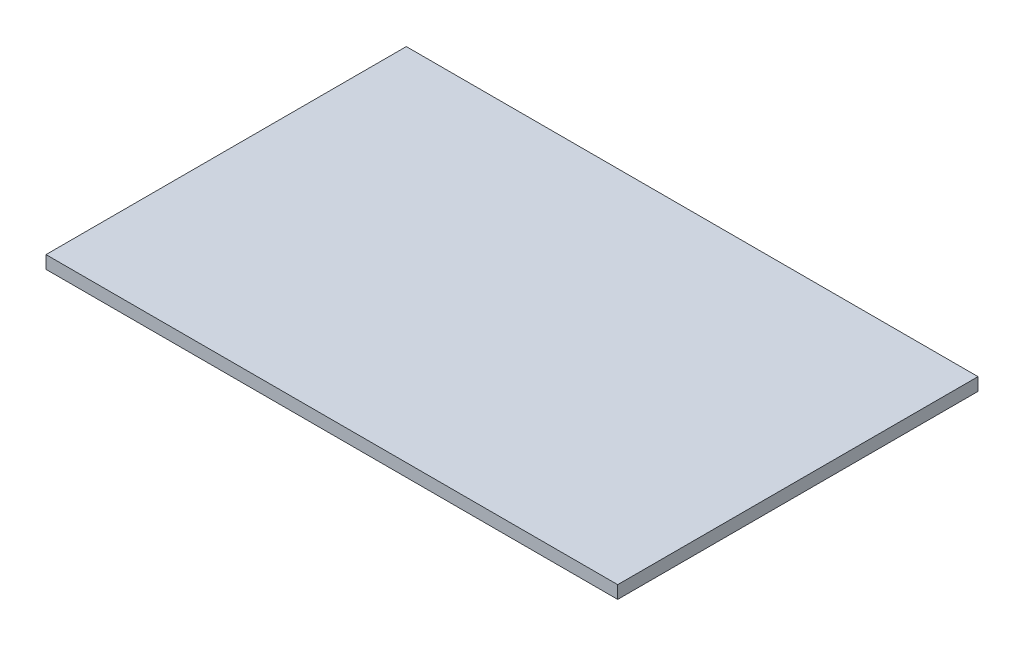
ISO-10303-21;
HEADER;
FILE_DESCRIPTION(('STEP AP214'),'2;1');
FILE_NAME('part.step','',(''),(''),'','','');
FILE_SCHEMA(('AUTOMOTIVE_DESIGN { 1 0 10303 214 1 1 1 1 }'));
ENDSEC;
DATA;
#1=APPLICATION_CONTEXT('core data for automotive mechanical design processes');
#2=APPLICATION_PROTOCOL_DEFINITION('international standard','automotive_design',2000,#1);
#3=PRODUCT_CONTEXT('',#1,'mechanical');
#4=PRODUCT('Part','Part','',(#3));
#5=PRODUCT_RELATED_PRODUCT_CATEGORY('part','',(#4));
#6=PRODUCT_DEFINITION_FORMATION('','',#4);
#7=PRODUCT_DEFINITION_CONTEXT('part definition',#1,'design');
#8=PRODUCT_DEFINITION('design','',#6,#7);
#9=PRODUCT_DEFINITION_SHAPE('','',#8);
#10=(LENGTH_UNIT() NAMED_UNIT(*) SI_UNIT(.MILLI.,.METRE.));
#11=(NAMED_UNIT(*) PLANE_ANGLE_UNIT() SI_UNIT($,.RADIAN.));
#12=(NAMED_UNIT(*) SI_UNIT($,.STERADIAN.) SOLID_ANGLE_UNIT());
#13=UNCERTAINTY_MEASURE_WITH_UNIT(LENGTH_MEASURE(1.E-05),#10,'distance_accuracy_value','');
#14=(GEOMETRIC_REPRESENTATION_CONTEXT(3) GLOBAL_UNCERTAINTY_ASSIGNED_CONTEXT((#13)) GLOBAL_UNIT_ASSIGNED_CONTEXT((#10,
#11,#12)) REPRESENTATION_CONTEXT('',''));
#15=CARTESIAN_POINT('',(0.,0.,0.));
#16=DIRECTION('',(0.,0.,1.));
#17=DIRECTION('',(1.,0.,0.));
#18=AXIS2_PLACEMENT_3D('',#15,#16,#17);
#19=CARTESIAN_POINT('',(178.5,8.,112.5));
#20=DIRECTION('',(-1.,0.,0.));
#21=DIRECTION('',(0.,0.,1.));
#22=AXIS2_PLACEMENT_3D('',#19,#20,#21);
#23=PLANE('',#22);
#24=DIRECTION('',(0.,0.,-1.));
#25=VECTOR('',#24,1.);
#26=CARTESIAN_POINT('',(178.5,0.,112.5));
#27=LINE('',#26,#25);
#28=CARTESIAN_POINT('',(178.5,0.,112.5));
#29=VERTEX_POINT('',#28);
#30=CARTESIAN_POINT('',(178.5,0.,-112.5));
#31=VERTEX_POINT('',#30);
#32=EDGE_CURVE('E96',#29,#31,#27,.T.);
#33=ORIENTED_EDGE('',*,*,#32,.T.);
#34=DIRECTION('',(0.,-1.,0.));
#35=VECTOR('',#34,1.);
#36=CARTESIAN_POINT('',(178.5,8.,-112.5));
#37=LINE('',#36,#35);
#38=CARTESIAN_POINT('',(178.5,8.,-112.5));
#39=VERTEX_POINT('',#38);
#40=EDGE_CURVE('E11',#39,#31,#37,.T.);
#41=ORIENTED_EDGE('',*,*,#40,.F.);
#42=DIRECTION('',(0.,0.,-1.));
#43=VECTOR('',#42,1.);
#44=CARTESIAN_POINT('',(178.5,8.,112.5));
#45=LINE('',#44,#43);
#46=CARTESIAN_POINT('',(178.5,8.,112.5));
#47=VERTEX_POINT('',#46);
#48=EDGE_CURVE('E84',#47,#39,#45,.T.);
#49=ORIENTED_EDGE('',*,*,#48,.F.);
#50=DIRECTION('',(0.,-1.,0.));
#51=VECTOR('',#50,1.);
#52=CARTESIAN_POINT('',(178.5,8.,112.5));
#53=LINE('',#52,#51);
#54=EDGE_CURVE('E92',#47,#29,#53,.T.);
#55=ORIENTED_EDGE('',*,*,#54,.T.);
#56=EDGE_LOOP('',(#33,#41,#49,#55));
#57=FACE_BOUND('',#56,.T.);
#58=ADVANCED_FACE('F33',(#57),#23,.F.);
#59=CARTESIAN_POINT('',(-178.5,8.,-112.5));
#60=DIRECTION('',(0.,0.,1.));
#61=DIRECTION('',(1.,0.,0.));
#62=AXIS2_PLACEMENT_3D('',#59,#60,#61);
#63=PLANE('',#62);
#64=DIRECTION('',(-1.,0.,0.));
#65=VECTOR('',#64,1.);
#66=CARTESIAN_POINT('',(-178.5,0.,-112.5));
#67=LINE('',#66,#65);
#68=CARTESIAN_POINT('',(-178.5,0.,-112.5));
#69=VERTEX_POINT('',#68);
#70=EDGE_CURVE('E88',#31,#69,#67,.T.);
#71=ORIENTED_EDGE('',*,*,#70,.T.);
#72=DIRECTION('',(0.,-1.,0.));
#73=VECTOR('',#72,1.);
#74=CARTESIAN_POINT('',(-178.5,8.,-112.5));
#75=LINE('',#74,#73);
#76=CARTESIAN_POINT('',(-178.5,8.,-112.5));
#77=VERTEX_POINT('',#76);
#78=EDGE_CURVE('E41',#77,#69,#75,.T.);
#79=ORIENTED_EDGE('',*,*,#78,.F.);
#80=DIRECTION('',(-1.,0.,0.));
#81=VECTOR('',#80,1.);
#82=CARTESIAN_POINT('',(-178.5,8.,-112.5));
#83=LINE('',#82,#81);
#84=EDGE_CURVE('E79',#39,#77,#83,.T.);
#85=ORIENTED_EDGE('',*,*,#84,.F.);
#86=ORIENTED_EDGE('',*,*,#40,.T.);
#87=EDGE_LOOP('',(#71,#79,#85,#86));
#88=FACE_BOUND('',#87,.T.);
#89=ADVANCED_FACE('F87',(#88),#63,.F.);
#90=CARTESIAN_POINT('',(-178.5,8.,112.5));
#91=DIRECTION('',(1.,0.,0.));
#92=DIRECTION('',(0.,0.,-1.));
#93=AXIS2_PLACEMENT_3D('',#90,#91,#92);
#94=PLANE('',#93);
#95=DIRECTION('',(0.,0.,1.));
#96=VECTOR('',#95,1.);
#97=CARTESIAN_POINT('',(-178.5,0.,112.5));
#98=LINE('',#97,#96);
#99=CARTESIAN_POINT('',(-178.5,0.,112.5));
#100=VERTEX_POINT('',#99);
#101=EDGE_CURVE('E66',#69,#100,#98,.T.);
#102=ORIENTED_EDGE('',*,*,#101,.T.);
#103=DIRECTION('',(0.,-1.,0.));
#104=VECTOR('',#103,1.);
#105=CARTESIAN_POINT('',(-178.5,8.,112.5));
#106=LINE('',#105,#104);
#107=CARTESIAN_POINT('',(-178.5,8.,112.5));
#108=VERTEX_POINT('',#107);
#109=EDGE_CURVE('E89',#108,#100,#106,.T.);
#110=ORIENTED_EDGE('',*,*,#109,.F.);
#111=DIRECTION('',(0.,0.,1.));
#112=VECTOR('',#111,1.);
#113=CARTESIAN_POINT('',(-178.5,8.,112.5));
#114=LINE('',#113,#112);
#115=EDGE_CURVE('E82',#77,#108,#114,.T.);
#116=ORIENTED_EDGE('',*,*,#115,.F.);
#117=ORIENTED_EDGE('',*,*,#78,.T.);
#118=EDGE_LOOP('',(#102,#110,#116,#117));
#119=FACE_BOUND('',#118,.T.);
#120=ADVANCED_FACE('F90',(#119),#94,.F.);
#121=CARTESIAN_POINT('',(-178.5,8.,112.5));
#122=DIRECTION('',(0.,0.,-1.));
#123=DIRECTION('',(-1.,0.,0.));
#124=AXIS2_PLACEMENT_3D('',#121,#122,#123);
#125=PLANE('',#124);
#126=DIRECTION('',(1.,0.,0.));
#127=VECTOR('',#126,1.);
#128=CARTESIAN_POINT('',(-178.5,0.,112.5));
#129=LINE('',#128,#127);
#130=EDGE_CURVE('E72',#100,#29,#129,.T.);
#131=ORIENTED_EDGE('',*,*,#130,.T.);
#132=ORIENTED_EDGE('',*,*,#54,.F.);
#133=DIRECTION('',(1.,0.,0.));
#134=VECTOR('',#133,1.);
#135=CARTESIAN_POINT('',(-178.5,8.,112.5));
#136=LINE('',#135,#134);
#137=EDGE_CURVE('E49',#108,#47,#136,.T.);
#138=ORIENTED_EDGE('',*,*,#137,.F.);
#139=ORIENTED_EDGE('',*,*,#109,.T.);
#140=EDGE_LOOP('',(#131,#132,#138,#139));
#141=FACE_BOUND('',#140,.T.);
#142=ADVANCED_FACE('F103',(#141),#125,.F.);
#143=CARTESIAN_POINT('',(0.,8.,0.));
#144=DIRECTION('',(0.,-1.,0.));
#145=DIRECTION('',(0.,0.,-1.));
#146=AXIS2_PLACEMENT_3D('',#143,#144,#145);
#147=PLANE('',#146);
#148=ORIENTED_EDGE('',*,*,#48,.T.);
#149=ORIENTED_EDGE('',*,*,#84,.T.);
#150=ORIENTED_EDGE('',*,*,#115,.T.);
#151=ORIENTED_EDGE('',*,*,#137,.T.);
#152=EDGE_LOOP('',(#148,#149,#150,#151));
#153=FACE_BOUND('',#152,.T.);
#154=ADVANCED_FACE('F80',(#153),#147,.F.);
#155=CARTESIAN_POINT('',(0.,0.,0.));
#156=DIRECTION('',(0.,-1.,0.));
#157=DIRECTION('',(0.,0.,-1.));
#158=AXIS2_PLACEMENT_3D('',#155,#156,#157);
#159=PLANE('',#158);
#160=ORIENTED_EDGE('',*,*,#32,.F.);
#161=ORIENTED_EDGE('',*,*,#130,.F.);
#162=ORIENTED_EDGE('',*,*,#101,.F.);
#163=ORIENTED_EDGE('',*,*,#70,.F.);
#164=EDGE_LOOP('',(#160,#161,#162,#163));
#165=FACE_BOUND('',#164,.T.);
#166=ADVANCED_FACE('F106',(#165),#159,.T.);
#167=CLOSED_SHELL('',(#58,#89,#120,#142,#154,#166));
#168=MANIFOLD_SOLID_BREP('B2',#167);
#169=ADVANCED_BREP_SHAPE_REPRESENTATION('',(#18,#168),#14);
#170=SHAPE_DEFINITION_REPRESENTATION(#9,#169);
ENDSEC;
END-ISO-10303-21;
